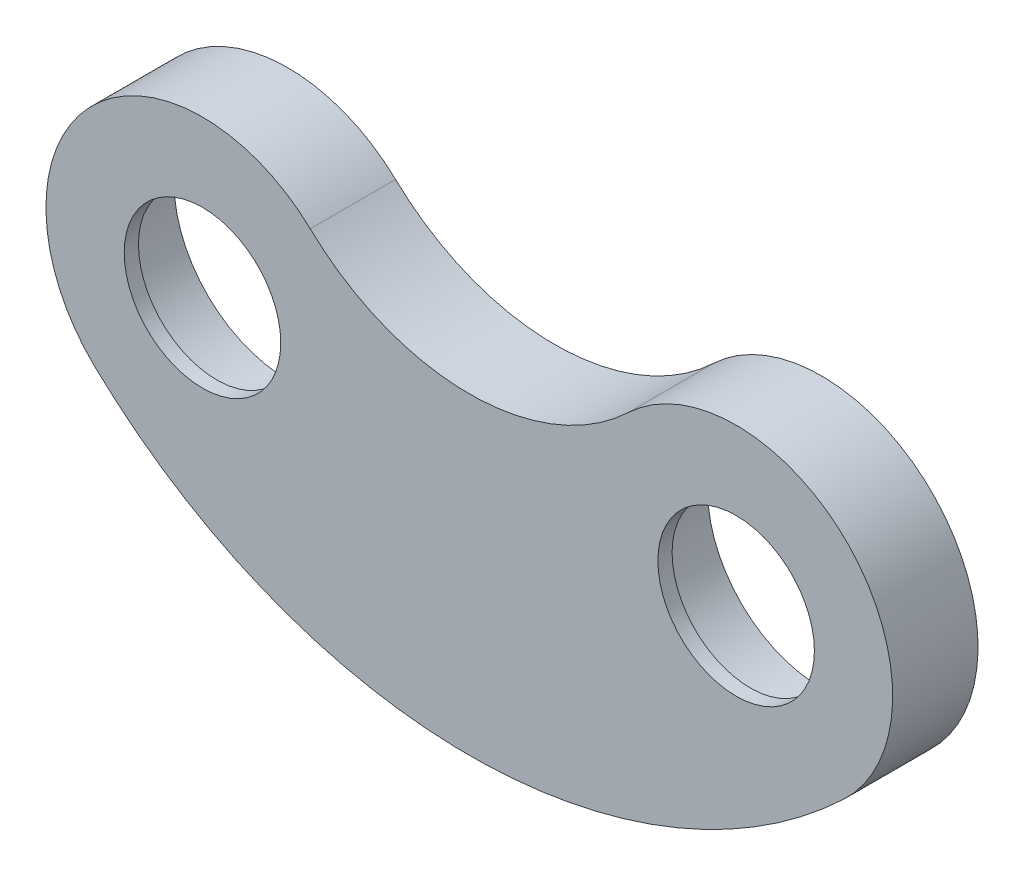
ISO-10303-21;
HEADER;
FILE_DESCRIPTION(('STEP AP214'),'2;1');
FILE_NAME('part.step','',(''),(''),'','','');
FILE_SCHEMA(('AUTOMOTIVE_DESIGN { 1 0 10303 214 1 1 1 1 }'));
ENDSEC;
DATA;
#1=APPLICATION_CONTEXT('core data for automotive mechanical design processes');
#2=APPLICATION_PROTOCOL_DEFINITION('international standard','automotive_design',2000,#1);
#3=PRODUCT_CONTEXT('',#1,'mechanical');
#4=PRODUCT('Part','Part','',(#3));
#5=PRODUCT_RELATED_PRODUCT_CATEGORY('part','',(#4));
#6=PRODUCT_DEFINITION_FORMATION('','',#4);
#7=PRODUCT_DEFINITION_CONTEXT('part definition',#1,'design');
#8=PRODUCT_DEFINITION('design','',#6,#7);
#9=PRODUCT_DEFINITION_SHAPE('','',#8);
#10=(LENGTH_UNIT() NAMED_UNIT(*) SI_UNIT(.MILLI.,.METRE.));
#11=(NAMED_UNIT(*) PLANE_ANGLE_UNIT() SI_UNIT($,.RADIAN.));
#12=(NAMED_UNIT(*) SI_UNIT($,.STERADIAN.) SOLID_ANGLE_UNIT());
#13=UNCERTAINTY_MEASURE_WITH_UNIT(LENGTH_MEASURE(1.E-05),#10,'distance_accuracy_value','');
#14=(GEOMETRIC_REPRESENTATION_CONTEXT(3) GLOBAL_UNCERTAINTY_ASSIGNED_CONTEXT((#13)) GLOBAL_UNIT_ASSIGNED_CONTEXT((#10,
#11,#12)) REPRESENTATION_CONTEXT('',''));
#15=CARTESIAN_POINT('',(0.,0.,0.));
#16=DIRECTION('',(0.,0.,1.));
#17=DIRECTION('',(1.,0.,0.));
#18=AXIS2_PLACEMENT_3D('',#15,#16,#17);
#19=CARTESIAN_POINT('',(33.0911369360264,0.558396059313507,12.));
#20=DIRECTION('',(0.,0.,-1.));
#21=DIRECTION('',(-1.,0.,0.));
#22=AXIS2_PLACEMENT_3D('',#19,#20,#21);
#23=CYLINDRICAL_SURFACE('',#22,11.);
#24=CARTESIAN_POINT('',(33.0911369360264,0.558396059313507,12.));
#25=DIRECTION('',(0.,0.,1.));
#26=DIRECTION('',(1.,0.,0.));
#27=AXIS2_PLACEMENT_3D('',#24,#25,#26);
#28=CIRCLE('',#27,11.);
#29=CARTESIAN_POINT('',(44.0911369360264,0.558396059313507,12.));
#30=VERTEX_POINT('',#29);
#31=EDGE_CURVE('E117',#30,#30,#28,.T.);
#32=ORIENTED_EDGE('',*,*,#31,.T.);
#33=EDGE_LOOP('',(#32));
#34=FACE_BOUND('',#33,.T.);
#35=CARTESIAN_POINT('',(33.0911369360264,0.558396059313507,10.));
#36=DIRECTION('',(0.,0.,-1.));
#37=DIRECTION('',(-1.,0.,0.));
#38=AXIS2_PLACEMENT_3D('',#35,#36,#37);
#39=CIRCLE('',#38,11.);
#40=CARTESIAN_POINT('',(22.0911369360264,0.558396059313507,10.));
#41=VERTEX_POINT('',#40);
#42=EDGE_CURVE('E43',#41,#41,#39,.T.);
#43=ORIENTED_EDGE('',*,*,#42,.T.);
#44=EDGE_LOOP('',(#43));
#45=FACE_BOUND('',#44,.T.);
#46=ADVANCED_FACE('F39',(#34,#45),#23,.F.);
#47=CARTESIAN_POINT('',(-41.9088630639736,0.558396059313511,12.));
#48=DIRECTION('',(0.,0.,-1.));
#49=DIRECTION('',(-1.,0.,0.));
#50=AXIS2_PLACEMENT_3D('',#47,#48,#49);
#51=CYLINDRICAL_SURFACE('',#50,11.);
#52=CARTESIAN_POINT('',(-41.9088630639736,0.558396059313511,12.));
#53=DIRECTION('',(0.,0.,1.));
#54=DIRECTION('',(1.,0.,0.));
#55=AXIS2_PLACEMENT_3D('',#52,#53,#54);
#56=CIRCLE('',#55,11.);
#57=CARTESIAN_POINT('',(-30.9088630639736,0.558396059313511,12.));
#58=VERTEX_POINT('',#57);
#59=EDGE_CURVE('E110',#58,#58,#56,.T.);
#60=ORIENTED_EDGE('',*,*,#59,.T.);
#61=EDGE_LOOP('',(#60));
#62=FACE_BOUND('',#61,.T.);
#63=CARTESIAN_POINT('',(-41.9088630639736,0.558396059313511,10.));
#64=DIRECTION('',(0.,0.,-1.));
#65=DIRECTION('',(-1.,0.,0.));
#66=AXIS2_PLACEMENT_3D('',#63,#64,#65);
#67=CIRCLE('',#66,11.);
#68=CARTESIAN_POINT('',(-52.9088630639736,0.558396059313511,10.));
#69=VERTEX_POINT('',#68);
#70=EDGE_CURVE('E115',#69,#69,#67,.T.);
#71=ORIENTED_EDGE('',*,*,#70,.T.);
#72=EDGE_LOOP('',(#71));
#73=FACE_BOUND('',#72,.T.);
#74=ADVANCED_FACE('F137',(#62,#73),#51,.F.);
#75=CARTESIAN_POINT('',(14.3411369360264,20.3321159925987,12.));
#76=DIRECTION('',(0.,0.,1.));
#77=DIRECTION('',(1.,0.,0.));
#78=AXIS2_PLACEMENT_3D('',#75,#76,#77);
#79=PLANE('',#78);
#80=ORIENTED_EDGE('',*,*,#59,.F.);
#81=EDGE_LOOP('',(#80));
#82=FACE_BOUND('',#81,.T.);
#83=CARTESIAN_POINT('',(-4.4088630639736,40.1058359258839,12.));
#84=DIRECTION('',(0.,0.,1.));
#85=DIRECTION('',(1.,0.,0.));
#86=AXIS2_PLACEMENT_3D('',#83,#84,#85);
#87=CIRCLE('',#86,76.5);
#88=CARTESIAN_POINT('',(-57.0464777428727,-15.4057081070085,12.));
#89=VERTEX_POINT('',#88);
#90=CARTESIAN_POINT('',(48.2287516149255,-15.4057081070085,12.));
#91=VERTEX_POINT('',#90);
#92=EDGE_CURVE('E94',#89,#91,#87,.T.);
#93=ORIENTED_EDGE('',*,*,#92,.T.);
#94=CARTESIAN_POINT('',(33.0911369360264,0.558396059313507,12.));
#95=DIRECTION('',(0.,0.,1.));
#96=DIRECTION('',(1.,0.,0.));
#97=AXIS2_PLACEMENT_3D('',#94,#95,#96);
#98=CIRCLE('',#97,22.);
#99=CARTESIAN_POINT('',(17.9535222571273,16.5225002256355,12.));
#100=VERTEX_POINT('',#99);
#101=EDGE_CURVE('E88',#91,#100,#98,.T.);
#102=ORIENTED_EDGE('',*,*,#101,.T.);
#103=CARTESIAN_POINT('',(-4.4088630639736,40.1058359258839,12.));
#104=DIRECTION('',(0.,0.,-1.));
#105=DIRECTION('',(1.,0.,0.));
#106=AXIS2_PLACEMENT_3D('',#103,#104,#105);
#107=CIRCLE('',#106,32.5);
#108=CARTESIAN_POINT('',(-26.7712483850745,16.5225002256355,12.));
#109=VERTEX_POINT('',#108);
#110=EDGE_CURVE('E92',#100,#109,#107,.T.);
#111=ORIENTED_EDGE('',*,*,#110,.T.);
#112=CARTESIAN_POINT('',(-41.9088630639736,0.558396059313511,12.));
#113=DIRECTION('',(0.,0.,1.));
#114=DIRECTION('',(1.,0.,0.));
#115=AXIS2_PLACEMENT_3D('',#112,#113,#114);
#116=CIRCLE('',#115,22.);
#117=EDGE_CURVE('E58',#109,#89,#116,.T.);
#118=ORIENTED_EDGE('',*,*,#117,.T.);
#119=EDGE_LOOP('',(#93,#102,#111,#118));
#120=FACE_BOUND('',#119,.T.);
#121=ORIENTED_EDGE('',*,*,#31,.F.);
#122=EDGE_LOOP('',(#121));
#123=FACE_BOUND('',#122,.T.);
#124=ADVANCED_FACE('F89',(#82,#120,#123),#79,.T.);
#125=CARTESIAN_POINT('',(14.3411369360264,20.3321159925987,0.));
#126=DIRECTION('',(0.,0.,1.));
#127=DIRECTION('',(1.,0.,0.));
#128=AXIS2_PLACEMENT_3D('',#125,#126,#127);
#129=PLANE('',#128);
#130=CARTESIAN_POINT('',(33.0911369360264,0.558396059313507,0.));
#131=DIRECTION('',(0.,0.,-1.));
#132=DIRECTION('',(-1.,0.,0.));
#133=AXIS2_PLACEMENT_3D('',#130,#131,#132);
#134=CIRCLE('',#133,16.);
#135=CARTESIAN_POINT('',(17.0911369360264,0.558396059313507,0.));
#136=VERTEX_POINT('',#135);
#137=EDGE_CURVE('E131',#136,#136,#134,.T.);
#138=ORIENTED_EDGE('',*,*,#137,.F.);
#139=EDGE_LOOP('',(#138));
#140=FACE_BOUND('',#139,.T.);
#141=CARTESIAN_POINT('',(-41.9088630639736,0.558396059313511,0.));
#142=DIRECTION('',(0.,0.,-1.));
#143=DIRECTION('',(-1.,0.,0.));
#144=AXIS2_PLACEMENT_3D('',#141,#142,#143);
#145=CIRCLE('',#144,16.);
#146=CARTESIAN_POINT('',(-57.9088630639736,0.558396059313511,0.));
#147=VERTEX_POINT('',#146);
#148=EDGE_CURVE('E124',#147,#147,#145,.T.);
#149=ORIENTED_EDGE('',*,*,#148,.F.);
#150=EDGE_LOOP('',(#149));
#151=FACE_BOUND('',#150,.T.);
#152=CARTESIAN_POINT('',(-4.4088630639736,40.1058359258839,0.));
#153=DIRECTION('',(0.,0.,1.));
#154=DIRECTION('',(1.,0.,0.));
#155=AXIS2_PLACEMENT_3D('',#152,#153,#154);
#156=CIRCLE('',#155,76.5);
#157=CARTESIAN_POINT('',(-57.0464777428727,-15.4057081070085,0.));
#158=VERTEX_POINT('',#157);
#159=CARTESIAN_POINT('',(48.2287516149255,-15.4057081070085,0.));
#160=VERTEX_POINT('',#159);
#161=EDGE_CURVE('E107',#158,#160,#156,.T.);
#162=ORIENTED_EDGE('',*,*,#161,.F.);
#163=CARTESIAN_POINT('',(-41.9088630639736,0.558396059313511,0.));
#164=DIRECTION('',(0.,0.,1.));
#165=DIRECTION('',(1.,0.,0.));
#166=AXIS2_PLACEMENT_3D('',#163,#164,#165);
#167=CIRCLE('',#166,22.);
#168=CARTESIAN_POINT('',(-26.7712483850745,16.5225002256355,0.));
#169=VERTEX_POINT('',#168);
#170=EDGE_CURVE('E81',#169,#158,#167,.T.);
#171=ORIENTED_EDGE('',*,*,#170,.F.);
#172=CARTESIAN_POINT('',(-4.4088630639736,40.1058359258839,0.));
#173=DIRECTION('',(0.,0.,-1.));
#174=DIRECTION('',(1.,0.,0.));
#175=AXIS2_PLACEMENT_3D('',#172,#173,#174);
#176=CIRCLE('',#175,32.5);
#177=CARTESIAN_POINT('',(17.9535222571273,16.5225002256355,0.));
#178=VERTEX_POINT('',#177);
#179=EDGE_CURVE('E75',#178,#169,#176,.T.);
#180=ORIENTED_EDGE('',*,*,#179,.F.);
#181=CARTESIAN_POINT('',(33.0911369360264,0.558396059313507,0.));
#182=DIRECTION('',(0.,0.,1.));
#183=DIRECTION('',(1.,0.,0.));
#184=AXIS2_PLACEMENT_3D('',#181,#182,#183);
#185=CIRCLE('',#184,22.);
#186=EDGE_CURVE('E98',#160,#178,#185,.T.);
#187=ORIENTED_EDGE('',*,*,#186,.F.);
#188=EDGE_LOOP('',(#162,#171,#180,#187));
#189=FACE_BOUND('',#188,.T.);
#190=ADVANCED_FACE('F140',(#140,#151,#189),#129,.F.);
#191=CARTESIAN_POINT('',(-4.4088630639736,40.1058359258839,12.));
#192=DIRECTION('',(0.,0.,-1.));
#193=DIRECTION('',(-1.,0.,0.));
#194=AXIS2_PLACEMENT_3D('',#191,#192,#193);
#195=CYLINDRICAL_SURFACE('',#194,76.5);
#196=ORIENTED_EDGE('',*,*,#161,.T.);
#197=DIRECTION('',(0.,0.,-1.));
#198=VECTOR('',#197,1.);
#199=CARTESIAN_POINT('',(48.2287516149255,-15.4057081070085,12.));
#200=LINE('',#199,#198);
#201=EDGE_CURVE('E11',#91,#160,#200,.T.);
#202=ORIENTED_EDGE('',*,*,#201,.F.);
#203=ORIENTED_EDGE('',*,*,#92,.F.);
#204=DIRECTION('',(0.,0.,-1.));
#205=VECTOR('',#204,1.);
#206=CARTESIAN_POINT('',(-57.0464777428727,-15.4057081070085,12.));
#207=LINE('',#206,#205);
#208=EDGE_CURVE('E103',#89,#158,#207,.T.);
#209=ORIENTED_EDGE('',*,*,#208,.T.);
#210=EDGE_LOOP('',(#196,#202,#203,#209));
#211=FACE_BOUND('',#210,.T.);
#212=ADVANCED_FACE('F41',(#211),#195,.T.);
#213=CARTESIAN_POINT('',(33.0911369360264,0.558396059313507,12.));
#214=DIRECTION('',(0.,0.,-1.));
#215=DIRECTION('',(-1.,0.,0.));
#216=AXIS2_PLACEMENT_3D('',#213,#214,#215);
#217=CYLINDRICAL_SURFACE('',#216,22.);
#218=ORIENTED_EDGE('',*,*,#186,.T.);
#219=DIRECTION('',(0.,0.,-1.));
#220=VECTOR('',#219,1.);
#221=CARTESIAN_POINT('',(17.9535222571273,16.5225002256355,12.));
#222=LINE('',#221,#220);
#223=EDGE_CURVE('E49',#100,#178,#222,.T.);
#224=ORIENTED_EDGE('',*,*,#223,.F.);
#225=ORIENTED_EDGE('',*,*,#101,.F.);
#226=ORIENTED_EDGE('',*,*,#201,.T.);
#227=EDGE_LOOP('',(#218,#224,#225,#226));
#228=FACE_BOUND('',#227,.T.);
#229=ADVANCED_FACE('F97',(#228),#217,.T.);
#230=CARTESIAN_POINT('',(-4.4088630639736,40.1058359258839,12.));
#231=DIRECTION('',(0.,0.,-1.));
#232=DIRECTION('',(-1.,0.,0.));
#233=AXIS2_PLACEMENT_3D('',#230,#231,#232);
#234=CYLINDRICAL_SURFACE('',#233,32.5);
#235=ORIENTED_EDGE('',*,*,#179,.T.);
#236=DIRECTION('',(0.,0.,-1.));
#237=VECTOR('',#236,1.);
#238=CARTESIAN_POINT('',(-26.7712483850745,16.5225002256355,12.));
#239=LINE('',#238,#237);
#240=EDGE_CURVE('E99',#109,#169,#239,.T.);
#241=ORIENTED_EDGE('',*,*,#240,.F.);
#242=ORIENTED_EDGE('',*,*,#110,.F.);
#243=ORIENTED_EDGE('',*,*,#223,.T.);
#244=EDGE_LOOP('',(#235,#241,#242,#243));
#245=FACE_BOUND('',#244,.T.);
#246=ADVANCED_FACE('F101',(#245),#234,.F.);
#247=CARTESIAN_POINT('',(-41.9088630639736,0.558396059313511,12.));
#248=DIRECTION('',(0.,0.,-1.));
#249=DIRECTION('',(-1.,0.,0.));
#250=AXIS2_PLACEMENT_3D('',#247,#248,#249);
#251=CYLINDRICAL_SURFACE('',#250,22.);
#252=ORIENTED_EDGE('',*,*,#170,.T.);
#253=ORIENTED_EDGE('',*,*,#208,.F.);
#254=ORIENTED_EDGE('',*,*,#117,.F.);
#255=ORIENTED_EDGE('',*,*,#240,.T.);
#256=EDGE_LOOP('',(#252,#253,#254,#255));
#257=FACE_BOUND('',#256,.T.);
#258=ADVANCED_FACE('F160',(#257),#251,.T.);
#259=CARTESIAN_POINT('',(-41.9088630639736,0.558396059313511,10.));
#260=DIRECTION('',(0.,0.,-1.));
#261=DIRECTION('',(-1.,0.,0.));
#262=AXIS2_PLACEMENT_3D('',#259,#260,#261);
#263=CYLINDRICAL_SURFACE('',#262,16.);
#264=CARTESIAN_POINT('',(-41.9088630639736,0.558396059313511,10.));
#265=DIRECTION('',(0.,0.,-1.));
#266=DIRECTION('',(-1.,0.,0.));
#267=AXIS2_PLACEMENT_3D('',#264,#265,#266);
#268=CIRCLE('',#267,16.);
#269=CARTESIAN_POINT('',(-57.9088630639736,0.558396059313511,10.));
#270=VERTEX_POINT('',#269);
#271=EDGE_CURVE('E118',#270,#270,#268,.T.);
#272=ORIENTED_EDGE('',*,*,#271,.F.);
#273=EDGE_LOOP('',(#272));
#274=FACE_BOUND('',#273,.T.);
#275=ORIENTED_EDGE('',*,*,#148,.T.);
#276=EDGE_LOOP('',(#275));
#277=FACE_BOUND('',#276,.T.);
#278=ADVANCED_FACE('F156',(#274,#277),#263,.F.);
#279=CARTESIAN_POINT('',(-41.9088630639736,0.558396059313511,10.));
#280=DIRECTION('',(0.,0.,-1.));
#281=DIRECTION('',(-1.,0.,0.));
#282=AXIS2_PLACEMENT_3D('',#279,#280,#281);
#283=PLANE('',#282);
#284=ORIENTED_EDGE('',*,*,#70,.F.);
#285=EDGE_LOOP('',(#284));
#286=FACE_BOUND('',#285,.T.);
#287=ORIENTED_EDGE('',*,*,#271,.T.);
#288=EDGE_LOOP('',(#287));
#289=FACE_BOUND('',#288,.T.);
#290=ADVANCED_FACE('F159',(#286,#289),#283,.T.);
#291=CARTESIAN_POINT('',(33.0911369360264,0.558396059313507,10.));
#292=DIRECTION('',(0.,0.,-1.));
#293=DIRECTION('',(-1.,0.,0.));
#294=AXIS2_PLACEMENT_3D('',#291,#292,#293);
#295=CYLINDRICAL_SURFACE('',#294,16.);
#296=CARTESIAN_POINT('',(33.0911369360264,0.558396059313507,10.));
#297=DIRECTION('',(0.,0.,-1.));
#298=DIRECTION('',(-1.,0.,0.));
#299=AXIS2_PLACEMENT_3D('',#296,#297,#298);
#300=CIRCLE('',#299,16.);
#301=CARTESIAN_POINT('',(17.0911369360264,0.558396059313507,10.));
#302=VERTEX_POINT('',#301);
#303=EDGE_CURVE('E179',#302,#302,#300,.T.);
#304=ORIENTED_EDGE('',*,*,#303,.F.);
#305=EDGE_LOOP('',(#304));
#306=FACE_BOUND('',#305,.T.);
#307=ORIENTED_EDGE('',*,*,#137,.T.);
#308=EDGE_LOOP('',(#307));
#309=FACE_BOUND('',#308,.T.);
#310=ADVANCED_FACE('F164',(#306,#309),#295,.F.);
#311=CARTESIAN_POINT('',(33.0911369360264,0.558396059313507,10.));
#312=DIRECTION('',(0.,0.,-1.));
#313=DIRECTION('',(-1.,0.,0.));
#314=AXIS2_PLACEMENT_3D('',#311,#312,#313);
#315=PLANE('',#314);
#316=ORIENTED_EDGE('',*,*,#42,.F.);
#317=EDGE_LOOP('',(#316));
#318=FACE_BOUND('',#317,.T.);
#319=ORIENTED_EDGE('',*,*,#303,.T.);
#320=EDGE_LOOP('',(#319));
#321=FACE_BOUND('',#320,.T.);
#322=ADVANCED_FACE('F168',(#318,#321),#315,.T.);
#323=CLOSED_SHELL('',(#46,#74,#124,#190,#212,#229,#246,#258,#278,#290,#310,#322));
#324=MANIFOLD_SOLID_BREP('B2',#323);
#325=ADVANCED_BREP_SHAPE_REPRESENTATION('',(#18,#324),#14);
#326=SHAPE_DEFINITION_REPRESENTATION(#9,#325);
ENDSEC;
END-ISO-10303-21;
